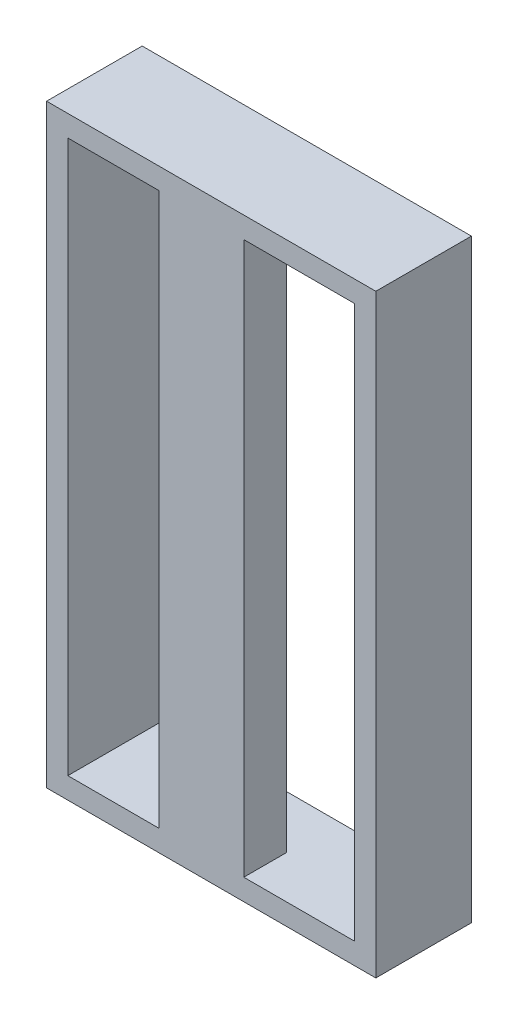
ISO-10303-21;
HEADER;
FILE_DESCRIPTION(('STEP AP214'),'2;1');
FILE_NAME('part.step','',(''),(''),'','','');
FILE_SCHEMA(('AUTOMOTIVE_DESIGN { 1 0 10303 214 1 1 1 1 }'));
ENDSEC;
DATA;
#1=APPLICATION_CONTEXT('core data for automotive mechanical design processes');
#2=APPLICATION_PROTOCOL_DEFINITION('international standard','automotive_design',2000,#1);
#3=PRODUCT_CONTEXT('',#1,'mechanical');
#4=PRODUCT('Part','Part','',(#3));
#5=PRODUCT_RELATED_PRODUCT_CATEGORY('part','',(#4));
#6=PRODUCT_DEFINITION_FORMATION('','',#4);
#7=PRODUCT_DEFINITION_CONTEXT('part definition',#1,'design');
#8=PRODUCT_DEFINITION('design','',#6,#7);
#9=PRODUCT_DEFINITION_SHAPE('','',#8);
#10=(LENGTH_UNIT() NAMED_UNIT(*) SI_UNIT(.MILLI.,.METRE.));
#11=(NAMED_UNIT(*) PLANE_ANGLE_UNIT() SI_UNIT($,.RADIAN.));
#12=(NAMED_UNIT(*) SI_UNIT($,.STERADIAN.) SOLID_ANGLE_UNIT());
#13=UNCERTAINTY_MEASURE_WITH_UNIT(LENGTH_MEASURE(1.E-05),#10,'distance_accuracy_value','');
#14=(GEOMETRIC_REPRESENTATION_CONTEXT(3) GLOBAL_UNCERTAINTY_ASSIGNED_CONTEXT((#13)) GLOBAL_UNIT_ASSIGNED_CONTEXT((#10,
#11,#12)) REPRESENTATION_CONTEXT('',''));
#15=CARTESIAN_POINT('',(0.,0.,0.));
#16=DIRECTION('',(0.,0.,1.));
#17=DIRECTION('',(1.,0.,0.));
#18=AXIS2_PLACEMENT_3D('',#15,#16,#17);
#19=CARTESIAN_POINT('',(0.,0.,9.));
#20=DIRECTION('',(0.,1.,0.));
#21=DIRECTION('',(0.,0.,1.));
#22=AXIS2_PLACEMENT_3D('',#19,#20,#21);
#23=PLANE('',#22);
#24=DIRECTION('',(1.,0.,0.));
#25=VECTOR('',#24,1.);
#26=CARTESIAN_POINT('',(0.,0.,0.));
#27=LINE('',#26,#25);
#28=CARTESIAN_POINT('',(-31.,0.,0.));
#29=VERTEX_POINT('',#28);
#30=CARTESIAN_POINT('',(0.,0.,0.));
#31=VERTEX_POINT('',#30);
#32=EDGE_CURVE('E184',#29,#31,#27,.T.);
#33=ORIENTED_EDGE('',*,*,#32,.T.);
#34=DIRECTION('',(0.,0.,-1.));
#35=VECTOR('',#34,1.);
#36=CARTESIAN_POINT('',(0.,0.,9.));
#37=LINE('',#36,#35);
#38=CARTESIAN_POINT('',(0.,0.,9.));
#39=VERTEX_POINT('',#38);
#40=EDGE_CURVE('E11',#39,#31,#37,.T.);
#41=ORIENTED_EDGE('',*,*,#40,.F.);
#42=DIRECTION('',(1.,0.,0.));
#43=VECTOR('',#42,1.);
#44=CARTESIAN_POINT('',(0.,0.,9.));
#45=LINE('',#44,#43);
#46=CARTESIAN_POINT('',(-31.,0.,9.));
#47=VERTEX_POINT('',#46);
#48=EDGE_CURVE('E192',#47,#39,#45,.T.);
#49=ORIENTED_EDGE('',*,*,#48,.F.);
#50=DIRECTION('',(0.,0.,-1.));
#51=VECTOR('',#50,1.);
#52=CARTESIAN_POINT('',(-31.,0.,9.));
#53=LINE('',#52,#51);
#54=EDGE_CURVE('E202',#47,#29,#53,.T.);
#55=ORIENTED_EDGE('',*,*,#54,.T.);
#56=EDGE_LOOP('',(#33,#41,#49,#55));
#57=FACE_BOUND('',#56,.T.);
#58=ADVANCED_FACE('F41',(#57),#23,.F.);
#59=CARTESIAN_POINT('',(0.,0.,9.));
#60=DIRECTION('',(-1.,0.,0.));
#61=DIRECTION('',(0.,0.,1.));
#62=AXIS2_PLACEMENT_3D('',#59,#60,#61);
#63=PLANE('',#62);
#64=DIRECTION('',(0.,1.,0.));
#65=VECTOR('',#64,1.);
#66=CARTESIAN_POINT('',(0.,0.,0.));
#67=LINE('',#66,#65);
#68=CARTESIAN_POINT('',(0.,56.,0.));
#69=VERTEX_POINT('',#68);
#70=EDGE_CURVE('E205',#31,#69,#67,.T.);
#71=ORIENTED_EDGE('',*,*,#70,.T.);
#72=DIRECTION('',(0.,0.,-1.));
#73=VECTOR('',#72,1.);
#74=CARTESIAN_POINT('',(0.,56.,9.));
#75=LINE('',#74,#73);
#76=CARTESIAN_POINT('',(0.,56.,9.));
#77=VERTEX_POINT('',#76);
#78=EDGE_CURVE('E48',#77,#69,#75,.T.);
#79=ORIENTED_EDGE('',*,*,#78,.F.);
#80=DIRECTION('',(0.,1.,0.));
#81=VECTOR('',#80,1.);
#82=CARTESIAN_POINT('',(0.,0.,9.));
#83=LINE('',#82,#81);
#84=EDGE_CURVE('E195',#39,#77,#83,.T.);
#85=ORIENTED_EDGE('',*,*,#84,.F.);
#86=ORIENTED_EDGE('',*,*,#40,.T.);
#87=EDGE_LOOP('',(#71,#79,#85,#86));
#88=FACE_BOUND('',#87,.T.);
#89=ADVANCED_FACE('F234',(#88),#63,.F.);
#90=CARTESIAN_POINT('',(0.,56.,9.));
#91=DIRECTION('',(0.,-1.,0.));
#92=DIRECTION('',(0.,0.,-1.));
#93=AXIS2_PLACEMENT_3D('',#90,#91,#92);
#94=PLANE('',#93);
#95=DIRECTION('',(-1.,0.,0.));
#96=VECTOR('',#95,1.);
#97=CARTESIAN_POINT('',(0.,56.,0.));
#98=LINE('',#97,#96);
#99=CARTESIAN_POINT('',(-31.,56.,0.));
#100=VERTEX_POINT('',#99);
#101=EDGE_CURVE('E207',#69,#100,#98,.T.);
#102=ORIENTED_EDGE('',*,*,#101,.T.);
#103=DIRECTION('',(0.,0.,-1.));
#104=VECTOR('',#103,1.);
#105=CARTESIAN_POINT('',(-31.,56.,9.));
#106=LINE('',#105,#104);
#107=CARTESIAN_POINT('',(-31.,56.,9.));
#108=VERTEX_POINT('',#107);
#109=EDGE_CURVE('E212',#108,#100,#106,.T.);
#110=ORIENTED_EDGE('',*,*,#109,.F.);
#111=DIRECTION('',(-1.,0.,0.));
#112=VECTOR('',#111,1.);
#113=CARTESIAN_POINT('',(0.,56.,9.));
#114=LINE('',#113,#112);
#115=EDGE_CURVE('E198',#77,#108,#114,.T.);
#116=ORIENTED_EDGE('',*,*,#115,.F.);
#117=ORIENTED_EDGE('',*,*,#78,.T.);
#118=EDGE_LOOP('',(#102,#110,#116,#117));
#119=FACE_BOUND('',#118,.T.);
#120=ADVANCED_FACE('F219',(#119),#94,.F.);
#121=CARTESIAN_POINT('',(-31.,0.,9.));
#122=DIRECTION('',(1.,0.,0.));
#123=DIRECTION('',(0.,0.,-1.));
#124=AXIS2_PLACEMENT_3D('',#121,#122,#123);
#125=PLANE('',#124);
#126=DIRECTION('',(0.,-1.,0.));
#127=VECTOR('',#126,1.);
#128=CARTESIAN_POINT('',(-31.,0.,0.));
#129=LINE('',#128,#127);
#130=EDGE_CURVE('E196',#100,#29,#129,.T.);
#131=ORIENTED_EDGE('',*,*,#130,.T.);
#132=ORIENTED_EDGE('',*,*,#54,.F.);
#133=DIRECTION('',(0.,-1.,0.));
#134=VECTOR('',#133,1.);
#135=CARTESIAN_POINT('',(-31.,0.,9.));
#136=LINE('',#135,#134);
#137=EDGE_CURVE('E200',#108,#47,#136,.T.);
#138=ORIENTED_EDGE('',*,*,#137,.F.);
#139=ORIENTED_EDGE('',*,*,#109,.T.);
#140=EDGE_LOOP('',(#131,#132,#138,#139));
#141=FACE_BOUND('',#140,.T.);
#142=ADVANCED_FACE('F228',(#141),#125,.F.);
#143=CARTESIAN_POINT('',(0.,0.,9.));
#144=DIRECTION('',(0.,0.,-1.));
#145=DIRECTION('',(-1.,0.,0.));
#146=AXIS2_PLACEMENT_3D('',#143,#144,#145);
#147=PLANE('',#146);
#148=DIRECTION('',(-1.,0.,0.));
#149=VECTOR('',#148,1.);
#150=CARTESIAN_POINT('',(-2.,54.,9.));
#151=LINE('',#150,#149);
#152=CARTESIAN_POINT('',(-20.4333682649154,54.,9.));
#153=VERTEX_POINT('',#152);
#154=CARTESIAN_POINT('',(-29.,54.,9.));
#155=VERTEX_POINT('',#154);
#156=EDGE_CURVE('E128',#153,#155,#151,.T.);
#157=ORIENTED_EDGE('',*,*,#156,.F.);
#158=DIRECTION('',(0.,-1.,0.));
#159=VECTOR('',#158,1.);
#160=CARTESIAN_POINT('',(-20.4333682649154,54.,9.));
#161=LINE('',#160,#159);
#162=CARTESIAN_POINT('',(-20.4333682649154,2.,9.));
#163=VERTEX_POINT('',#162);
#164=EDGE_CURVE('E133',#153,#163,#161,.T.);
#165=ORIENTED_EDGE('',*,*,#164,.T.);
#166=DIRECTION('',(1.,0.,0.));
#167=VECTOR('',#166,1.);
#168=CARTESIAN_POINT('',(-29.,2.,9.));
#169=LINE('',#168,#167);
#170=CARTESIAN_POINT('',(-29.,2.,9.));
#171=VERTEX_POINT('',#170);
#172=EDGE_CURVE('E178',#171,#163,#169,.T.);
#173=ORIENTED_EDGE('',*,*,#172,.F.);
#174=DIRECTION('',(0.,-1.,0.));
#175=VECTOR('',#174,1.);
#176=CARTESIAN_POINT('',(-29.,54.,9.));
#177=LINE('',#176,#175);
#178=EDGE_CURVE('E134',#155,#171,#177,.T.);
#179=ORIENTED_EDGE('',*,*,#178,.F.);
#180=EDGE_LOOP('',(#157,#165,#173,#179));
#181=FACE_BOUND('',#180,.T.);
#182=DIRECTION('',(0.,1.,0.));
#183=VECTOR('',#182,1.);
#184=CARTESIAN_POINT('',(-12.4333682649154,54.,9.));
#185=LINE('',#184,#183);
#186=CARTESIAN_POINT('',(-12.4333682649154,2.,9.));
#187=VERTEX_POINT('',#186);
#188=CARTESIAN_POINT('',(-12.4333682649154,54.,9.));
#189=VERTEX_POINT('',#188);
#190=EDGE_CURVE('E149',#187,#189,#185,.T.);
#191=ORIENTED_EDGE('',*,*,#190,.T.);
#192=CARTESIAN_POINT('',(-2.,54.,9.));
#193=VERTEX_POINT('',#192);
#194=EDGE_CURVE('E136',#193,#189,#151,.T.);
#195=ORIENTED_EDGE('',*,*,#194,.F.);
#196=DIRECTION('',(0.,1.,0.));
#197=VECTOR('',#196,1.);
#198=CARTESIAN_POINT('',(-2.,2.,9.));
#199=LINE('',#198,#197);
#200=CARTESIAN_POINT('',(-2.,2.,9.));
#201=VERTEX_POINT('',#200);
#202=EDGE_CURVE('E137',#201,#193,#199,.T.);
#203=ORIENTED_EDGE('',*,*,#202,.F.);
#204=EDGE_CURVE('E177',#187,#201,#169,.T.);
#205=ORIENTED_EDGE('',*,*,#204,.F.);
#206=EDGE_LOOP('',(#191,#195,#203,#205));
#207=FACE_BOUND('',#206,.T.);
#208=ORIENTED_EDGE('',*,*,#48,.T.);
#209=ORIENTED_EDGE('',*,*,#84,.T.);
#210=ORIENTED_EDGE('',*,*,#115,.T.);
#211=ORIENTED_EDGE('',*,*,#137,.T.);
#212=EDGE_LOOP('',(#208,#209,#210,#211));
#213=FACE_BOUND('',#212,.T.);
#214=ADVANCED_FACE('F129',(#181,#207,#213),#147,.F.);
#215=CARTESIAN_POINT('',(0.,0.,0.));
#216=DIRECTION('',(0.,0.,-1.));
#217=DIRECTION('',(-1.,0.,0.));
#218=AXIS2_PLACEMENT_3D('',#215,#216,#217);
#219=PLANE('',#218);
#220=DIRECTION('',(0.,-1.,0.));
#221=VECTOR('',#220,1.);
#222=CARTESIAN_POINT('',(-29.,54.,0.));
#223=LINE('',#222,#221);
#224=CARTESIAN_POINT('',(-29.,54.,0.));
#225=VERTEX_POINT('',#224);
#226=CARTESIAN_POINT('',(-29.,2.,0.));
#227=VERTEX_POINT('',#226);
#228=EDGE_CURVE('E163',#225,#227,#223,.T.);
#229=ORIENTED_EDGE('',*,*,#228,.T.);
#230=DIRECTION('',(1.,0.,0.));
#231=VECTOR('',#230,1.);
#232=CARTESIAN_POINT('',(-29.,2.,0.));
#233=LINE('',#232,#231);
#234=CARTESIAN_POINT('',(-2.,2.,0.));
#235=VERTEX_POINT('',#234);
#236=EDGE_CURVE('E166',#227,#235,#233,.T.);
#237=ORIENTED_EDGE('',*,*,#236,.T.);
#238=DIRECTION('',(0.,1.,0.));
#239=VECTOR('',#238,1.);
#240=CARTESIAN_POINT('',(-2.,2.,0.));
#241=LINE('',#240,#239);
#242=CARTESIAN_POINT('',(-2.,54.,0.));
#243=VERTEX_POINT('',#242);
#244=EDGE_CURVE('E169',#235,#243,#241,.T.);
#245=ORIENTED_EDGE('',*,*,#244,.T.);
#246=DIRECTION('',(-1.,0.,0.));
#247=VECTOR('',#246,1.);
#248=CARTESIAN_POINT('',(-2.,54.,0.));
#249=LINE('',#248,#247);
#250=EDGE_CURVE('E172',#243,#225,#249,.T.);
#251=ORIENTED_EDGE('',*,*,#250,.T.);
#252=EDGE_LOOP('',(#229,#237,#245,#251));
#253=FACE_BOUND('',#252,.T.);
#254=ORIENTED_EDGE('',*,*,#32,.F.);
#255=ORIENTED_EDGE('',*,*,#130,.F.);
#256=ORIENTED_EDGE('',*,*,#101,.F.);
#257=ORIENTED_EDGE('',*,*,#70,.F.);
#258=EDGE_LOOP('',(#254,#255,#256,#257));
#259=FACE_BOUND('',#258,.T.);
#260=ADVANCED_FACE('F225',(#253,#259),#219,.T.);
#261=CARTESIAN_POINT('',(-29.,54.,0.));
#262=DIRECTION('',(-1.,0.,0.));
#263=DIRECTION('',(0.,0.,1.));
#264=AXIS2_PLACEMENT_3D('',#261,#262,#263);
#265=PLANE('',#264);
#266=ORIENTED_EDGE('',*,*,#178,.T.);
#267=DIRECTION('',(0.,0.,1.));
#268=VECTOR('',#267,1.);
#269=CARTESIAN_POINT('',(-29.,2.,0.));
#270=LINE('',#269,#268);
#271=EDGE_CURVE('E175',#227,#171,#270,.T.);
#272=ORIENTED_EDGE('',*,*,#271,.F.);
#273=ORIENTED_EDGE('',*,*,#228,.F.);
#274=DIRECTION('',(0.,0.,1.));
#275=VECTOR('',#274,1.);
#276=CARTESIAN_POINT('',(-29.,54.,0.));
#277=LINE('',#276,#275);
#278=EDGE_CURVE('E182',#225,#155,#277,.T.);
#279=ORIENTED_EDGE('',*,*,#278,.T.);
#280=EDGE_LOOP('',(#266,#272,#273,#279));
#281=FACE_BOUND('',#280,.T.);
#282=ADVANCED_FACE('F246',(#281),#265,.F.);
#283=CARTESIAN_POINT('',(-2.,54.,0.));
#284=DIRECTION('',(0.,1.,0.));
#285=DIRECTION('',(0.,0.,1.));
#286=AXIS2_PLACEMENT_3D('',#283,#284,#285);
#287=PLANE('',#286);
#288=ORIENTED_EDGE('',*,*,#194,.T.);
#289=DIRECTION('',(0.,0.,1.));
#290=VECTOR('',#289,1.);
#291=CARTESIAN_POINT('',(-12.4333682649154,54.,5.));
#292=LINE('',#291,#290);
#293=CARTESIAN_POINT('',(-12.4333682649154,54.,5.));
#294=VERTEX_POINT('',#293);
#295=EDGE_CURVE('E60',#294,#189,#292,.T.);
#296=ORIENTED_EDGE('',*,*,#295,.F.);
#297=DIRECTION('',(-1.,0.,0.));
#298=VECTOR('',#297,1.);
#299=CARTESIAN_POINT('',(-12.4333682649154,54.,5.));
#300=LINE('',#299,#298);
#301=CARTESIAN_POINT('',(-20.4333682649154,54.,5.));
#302=VERTEX_POINT('',#301);
#303=EDGE_CURVE('E55',#294,#302,#300,.T.);
#304=ORIENTED_EDGE('',*,*,#303,.T.);
#305=DIRECTION('',(0.,0.,1.));
#306=VECTOR('',#305,1.);
#307=CARTESIAN_POINT('',(-20.4333682649154,54.,5.));
#308=LINE('',#307,#306);
#309=EDGE_CURVE('E139',#302,#153,#308,.T.);
#310=ORIENTED_EDGE('',*,*,#309,.T.);
#311=ORIENTED_EDGE('',*,*,#156,.T.);
#312=ORIENTED_EDGE('',*,*,#278,.F.);
#313=ORIENTED_EDGE('',*,*,#250,.F.);
#314=DIRECTION('',(0.,0.,1.));
#315=VECTOR('',#314,1.);
#316=CARTESIAN_POINT('',(-2.,54.,0.));
#317=LINE('',#316,#315);
#318=EDGE_CURVE('E185',#243,#193,#317,.T.);
#319=ORIENTED_EDGE('',*,*,#318,.T.);
#320=EDGE_LOOP('',(#288,#296,#304,#310,#311,#312,#313,#319));
#321=FACE_BOUND('',#320,.T.);
#322=ADVANCED_FACE('F140',(#321),#287,.F.);
#323=CARTESIAN_POINT('',(-2.,2.,0.));
#324=DIRECTION('',(1.,0.,0.));
#325=DIRECTION('',(0.,0.,-1.));
#326=AXIS2_PLACEMENT_3D('',#323,#324,#325);
#327=PLANE('',#326);
#328=ORIENTED_EDGE('',*,*,#202,.T.);
#329=ORIENTED_EDGE('',*,*,#318,.F.);
#330=ORIENTED_EDGE('',*,*,#244,.F.);
#331=DIRECTION('',(0.,0.,1.));
#332=VECTOR('',#331,1.);
#333=CARTESIAN_POINT('',(-2.,2.,0.));
#334=LINE('',#333,#332);
#335=EDGE_CURVE('E187',#235,#201,#334,.T.);
#336=ORIENTED_EDGE('',*,*,#335,.T.);
#337=EDGE_LOOP('',(#328,#329,#330,#336));
#338=FACE_BOUND('',#337,.T.);
#339=ADVANCED_FACE('F257',(#338),#327,.F.);
#340=CARTESIAN_POINT('',(-29.,2.,0.));
#341=DIRECTION('',(0.,-1.,0.));
#342=DIRECTION('',(0.,0.,-1.));
#343=AXIS2_PLACEMENT_3D('',#340,#341,#342);
#344=PLANE('',#343);
#345=DIRECTION('',(1.,0.,0.));
#346=VECTOR('',#345,1.);
#347=CARTESIAN_POINT('',(-12.4333682649154,2.,5.));
#348=LINE('',#347,#346);
#349=CARTESIAN_POINT('',(-20.4333682649154,2.,5.));
#350=VERTEX_POINT('',#349);
#351=CARTESIAN_POINT('',(-12.4333682649154,2.,5.));
#352=VERTEX_POINT('',#351);
#353=EDGE_CURVE('E162',#350,#352,#348,.T.);
#354=ORIENTED_EDGE('',*,*,#353,.T.);
#355=DIRECTION('',(0.,0.,1.));
#356=VECTOR('',#355,1.);
#357=CARTESIAN_POINT('',(-12.4333682649154,2.,5.));
#358=LINE('',#357,#356);
#359=EDGE_CURVE('E157',#352,#187,#358,.T.);
#360=ORIENTED_EDGE('',*,*,#359,.T.);
#361=ORIENTED_EDGE('',*,*,#204,.T.);
#362=ORIENTED_EDGE('',*,*,#335,.F.);
#363=ORIENTED_EDGE('',*,*,#236,.F.);
#364=ORIENTED_EDGE('',*,*,#271,.T.);
#365=ORIENTED_EDGE('',*,*,#172,.T.);
#366=DIRECTION('',(0.,0.,1.));
#367=VECTOR('',#366,1.);
#368=CARTESIAN_POINT('',(-20.4333682649154,2.,5.));
#369=LINE('',#368,#367);
#370=EDGE_CURVE('E144',#350,#163,#369,.T.);
#371=ORIENTED_EDGE('',*,*,#370,.F.);
#372=EDGE_LOOP('',(#354,#360,#361,#362,#363,#364,#365,#371));
#373=FACE_BOUND('',#372,.T.);
#374=ADVANCED_FACE('F253',(#373),#344,.F.);
#375=CARTESIAN_POINT('',(-12.4333682649154,54.,5.));
#376=DIRECTION('',(1.,0.,0.));
#377=DIRECTION('',(0.,1.,0.));
#378=AXIS2_PLACEMENT_3D('',#375,#376,#377);
#379=PLANE('',#378);
#380=ORIENTED_EDGE('',*,*,#190,.F.);
#381=ORIENTED_EDGE('',*,*,#359,.F.);
#382=DIRECTION('',(0.,1.,0.));
#383=VECTOR('',#382,1.);
#384=CARTESIAN_POINT('',(-12.4333682649154,54.,5.));
#385=LINE('',#384,#383);
#386=EDGE_CURVE('E148',#352,#294,#385,.T.);
#387=ORIENTED_EDGE('',*,*,#386,.T.);
#388=ORIENTED_EDGE('',*,*,#295,.T.);
#389=EDGE_LOOP('',(#380,#381,#387,#388));
#390=FACE_BOUND('',#389,.T.);
#391=ADVANCED_FACE('F256',(#390),#379,.T.);
#392=CARTESIAN_POINT('',(-20.4333682649154,54.,5.));
#393=DIRECTION('',(-1.,0.,0.));
#394=DIRECTION('',(0.,0.,1.));
#395=AXIS2_PLACEMENT_3D('',#392,#393,#394);
#396=PLANE('',#395);
#397=ORIENTED_EDGE('',*,*,#164,.F.);
#398=ORIENTED_EDGE('',*,*,#309,.F.);
#399=DIRECTION('',(0.,-1.,0.));
#400=VECTOR('',#399,1.);
#401=CARTESIAN_POINT('',(-20.4333682649154,54.,5.));
#402=LINE('',#401,#400);
#403=EDGE_CURVE('E279',#302,#350,#402,.T.);
#404=ORIENTED_EDGE('',*,*,#403,.T.);
#405=ORIENTED_EDGE('',*,*,#370,.T.);
#406=EDGE_LOOP('',(#397,#398,#404,#405));
#407=FACE_BOUND('',#406,.T.);
#408=ADVANCED_FACE('F147',(#407),#396,.T.);
#409=CARTESIAN_POINT('',(0.,0.,5.));
#410=DIRECTION('',(0.,0.,-1.));
#411=DIRECTION('',(-1.,0.,0.));
#412=AXIS2_PLACEMENT_3D('',#409,#410,#411);
#413=PLANE('',#412);
#414=ORIENTED_EDGE('',*,*,#386,.F.);
#415=ORIENTED_EDGE('',*,*,#353,.F.);
#416=ORIENTED_EDGE('',*,*,#403,.F.);
#417=ORIENTED_EDGE('',*,*,#303,.F.);
#418=EDGE_LOOP('',(#414,#415,#416,#417));
#419=FACE_BOUND('',#418,.T.);
#420=ADVANCED_FACE('F269',(#419),#413,.T.);
#421=CLOSED_SHELL('',(#58,#89,#120,#142,#214,#260,#282,#322,#339,#374,#391,#408,#420));
#422=MANIFOLD_SOLID_BREP('B2',#421);
#423=ADVANCED_BREP_SHAPE_REPRESENTATION('',(#18,#422),#14);
#424=SHAPE_DEFINITION_REPRESENTATION(#9,#423);
ENDSEC;
END-ISO-10303-21;
